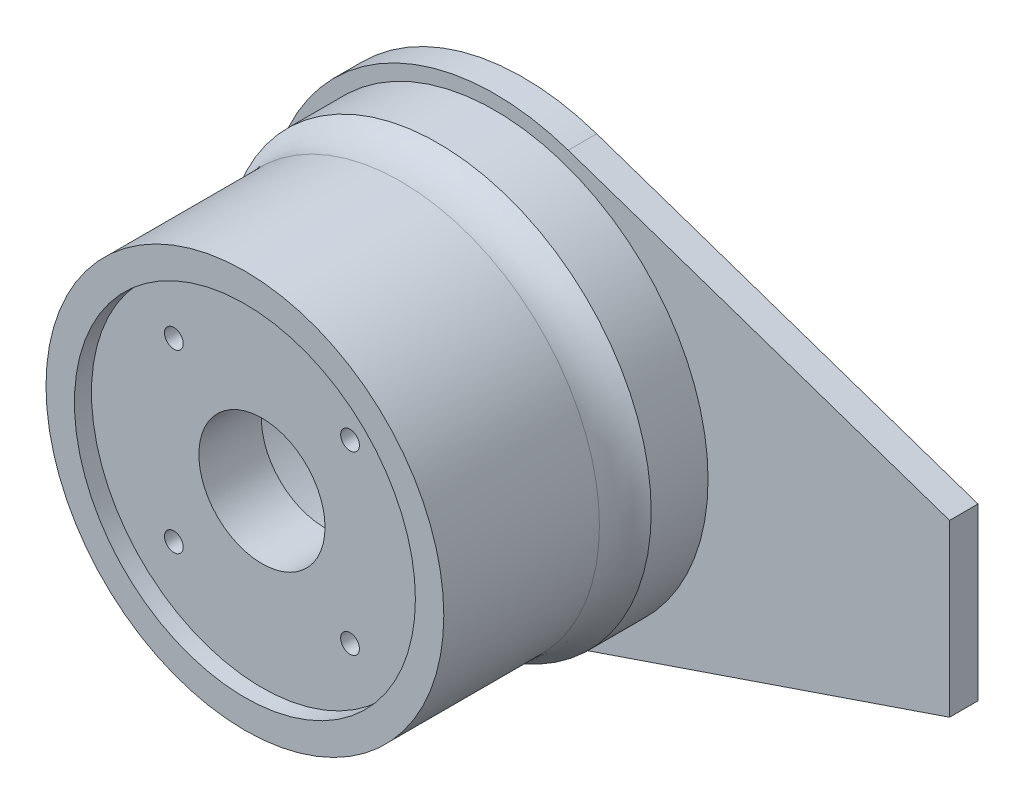
ISO-10303-21;
HEADER;
FILE_DESCRIPTION(('STEP AP214'),'2;1');
FILE_NAME('part.step','',(''),(''),'','','');
FILE_SCHEMA(('AUTOMOTIVE_DESIGN { 1 0 10303 214 1 1 1 1 }'));
ENDSEC;
DATA;
#1=APPLICATION_CONTEXT('core data for automotive mechanical design processes');
#2=APPLICATION_PROTOCOL_DEFINITION('international standard','automotive_design',2000,#1);
#3=PRODUCT_CONTEXT('',#1,'mechanical');
#4=PRODUCT('Part','Part','',(#3));
#5=PRODUCT_RELATED_PRODUCT_CATEGORY('part','',(#4));
#6=PRODUCT_DEFINITION_FORMATION('','',#4);
#7=PRODUCT_DEFINITION_CONTEXT('part definition',#1,'design');
#8=PRODUCT_DEFINITION('design','',#6,#7);
#9=PRODUCT_DEFINITION_SHAPE('','',#8);
#10=(LENGTH_UNIT() NAMED_UNIT(*) SI_UNIT(.MILLI.,.METRE.));
#11=(NAMED_UNIT(*) PLANE_ANGLE_UNIT() SI_UNIT($,.RADIAN.));
#12=(NAMED_UNIT(*) SI_UNIT($,.STERADIAN.) SOLID_ANGLE_UNIT());
#13=UNCERTAINTY_MEASURE_WITH_UNIT(LENGTH_MEASURE(1.E-05),#10,'distance_accuracy_value','');
#14=(GEOMETRIC_REPRESENTATION_CONTEXT(3) GLOBAL_UNCERTAINTY_ASSIGNED_CONTEXT((#13)) GLOBAL_UNIT_ASSIGNED_CONTEXT((#10,
#11,#12)) REPRESENTATION_CONTEXT('',''));
#15=CARTESIAN_POINT('',(0.,0.,0.));
#16=DIRECTION('',(0.,0.,1.));
#17=DIRECTION('',(1.,0.,0.));
#18=AXIS2_PLACEMENT_3D('',#15,#16,#17);
#19=CARTESIAN_POINT('',(0.,0.,14.));
#20=DIRECTION('',(0.,0.,-1.));
#21=DIRECTION('',(-1.,0.,0.));
#22=AXIS2_PLACEMENT_3D('',#19,#20,#21);
#23=CYLINDRICAL_SURFACE('',#22,11.1);
#24=CARTESIAN_POINT('',(0.,0.,0.));
#25=DIRECTION('',(0.,0.,1.));
#26=DIRECTION('',(1.,0.,0.));
#27=AXIS2_PLACEMENT_3D('',#24,#25,#26);
#28=CIRCLE('',#27,11.1);
#29=CARTESIAN_POINT('',(11.1,0.,0.));
#30=VERTEX_POINT('',#29);
#31=EDGE_CURVE('E127',#30,#30,#28,.T.);
#32=ORIENTED_EDGE('',*,*,#31,.F.);
#33=EDGE_LOOP('',(#32));
#34=FACE_BOUND('',#33,.T.);
#35=CARTESIAN_POINT('',(0.,0.,11.));
#36=DIRECTION('',(0.,0.,1.));
#37=DIRECTION('',(1.,0.,0.));
#38=AXIS2_PLACEMENT_3D('',#35,#36,#37);
#39=CIRCLE('',#38,11.1);
#40=CARTESIAN_POINT('',(11.1,0.,11.));
#41=VERTEX_POINT('',#40);
#42=EDGE_CURVE('E151',#41,#41,#39,.T.);
#43=ORIENTED_EDGE('',*,*,#42,.T.);
#44=EDGE_LOOP('',(#43));
#45=FACE_BOUND('',#44,.T.);
#46=ADVANCED_FACE('F35',(#34,#45),#23,.F.);
#47=CARTESIAN_POINT('',(-15.5,15.5,14.));
#48=DIRECTION('',(0.,0.,-1.));
#49=DIRECTION('',(-1.,0.,0.));
#50=AXIS2_PLACEMENT_3D('',#47,#48,#49);
#51=CYLINDRICAL_SURFACE('',#50,1.65);
#52=CARTESIAN_POINT('',(-15.5,15.5,0.));
#53=DIRECTION('',(0.,0.,1.));
#54=DIRECTION('',(1.,0.,0.));
#55=AXIS2_PLACEMENT_3D('',#52,#53,#54);
#56=CIRCLE('',#55,1.65);
#57=CARTESIAN_POINT('',(-13.85,15.5,0.));
#58=VERTEX_POINT('',#57);
#59=EDGE_CURVE('E136',#58,#58,#56,.T.);
#60=ORIENTED_EDGE('',*,*,#59,.F.);
#61=EDGE_LOOP('',(#60));
#62=FACE_BOUND('',#61,.T.);
#63=CARTESIAN_POINT('',(-15.5,15.5,11.));
#64=DIRECTION('',(0.,0.,1.));
#65=DIRECTION('',(1.,0.,0.));
#66=AXIS2_PLACEMENT_3D('',#63,#64,#65);
#67=CIRCLE('',#66,1.65);
#68=CARTESIAN_POINT('',(-13.85,15.5,11.));
#69=VERTEX_POINT('',#68);
#70=EDGE_CURVE('E153',#69,#69,#67,.T.);
#71=ORIENTED_EDGE('',*,*,#70,.T.);
#72=EDGE_LOOP('',(#71));
#73=FACE_BOUND('',#72,.T.);
#74=ADVANCED_FACE('F147',(#62,#73),#51,.F.);
#75=CARTESIAN_POINT('',(15.5,15.5000000000009,14.));
#76=DIRECTION('',(0.,0.,-1.));
#77=DIRECTION('',(-1.,0.,0.));
#78=AXIS2_PLACEMENT_3D('',#75,#76,#77);
#79=CYLINDRICAL_SURFACE('',#78,1.65000000000096);
#80=CARTESIAN_POINT('',(15.5,15.5000000000009,0.));
#81=DIRECTION('',(0.,0.,1.));
#82=DIRECTION('',(1.,0.,0.));
#83=AXIS2_PLACEMENT_3D('',#80,#81,#82);
#84=CIRCLE('',#83,1.65000000000096);
#85=CARTESIAN_POINT('',(17.150000000001,15.5000000000009,0.));
#86=VERTEX_POINT('',#85);
#87=EDGE_CURVE('E133',#86,#86,#84,.T.);
#88=ORIENTED_EDGE('',*,*,#87,.F.);
#89=EDGE_LOOP('',(#88));
#90=FACE_BOUND('',#89,.T.);
#91=CARTESIAN_POINT('',(15.5,15.5000000000009,11.));
#92=DIRECTION('',(0.,0.,1.));
#93=DIRECTION('',(1.,0.,0.));
#94=AXIS2_PLACEMENT_3D('',#91,#92,#93);
#95=CIRCLE('',#94,1.65000000000096);
#96=CARTESIAN_POINT('',(17.150000000001,15.5000000000009,11.));
#97=VERTEX_POINT('',#96);
#98=EDGE_CURVE('E158',#97,#97,#95,.T.);
#99=ORIENTED_EDGE('',*,*,#98,.T.);
#100=EDGE_LOOP('',(#99));
#101=FACE_BOUND('',#100,.T.);
#102=ADVANCED_FACE('F226',(#90,#101),#79,.F.);
#103=CARTESIAN_POINT('',(15.5000000000009,-15.4999999999991,14.));
#104=DIRECTION('',(0.,0.,-1.));
#105=DIRECTION('',(-1.,0.,0.));
#106=AXIS2_PLACEMENT_3D('',#103,#104,#105);
#107=CYLINDRICAL_SURFACE('',#106,1.65000000000129);
#108=CARTESIAN_POINT('',(15.5000000000009,-15.4999999999991,0.));
#109=DIRECTION('',(0.,0.,1.));
#110=DIRECTION('',(1.,0.,0.));
#111=AXIS2_PLACEMENT_3D('',#108,#109,#110);
#112=CIRCLE('',#111,1.65000000000129);
#113=CARTESIAN_POINT('',(17.1500000000022,-15.4999999999991,0.));
#114=VERTEX_POINT('',#113);
#115=EDGE_CURVE('E130',#114,#114,#112,.T.);
#116=ORIENTED_EDGE('',*,*,#115,.F.);
#117=EDGE_LOOP('',(#116));
#118=FACE_BOUND('',#117,.T.);
#119=CARTESIAN_POINT('',(15.5000000000009,-15.4999999999991,11.));
#120=DIRECTION('',(0.,0.,1.));
#121=DIRECTION('',(1.,0.,0.));
#122=AXIS2_PLACEMENT_3D('',#119,#120,#121);
#123=CIRCLE('',#122,1.65000000000129);
#124=CARTESIAN_POINT('',(17.1500000000022,-15.4999999999991,11.));
#125=VERTEX_POINT('',#124);
#126=EDGE_CURVE('E163',#125,#125,#123,.T.);
#127=ORIENTED_EDGE('',*,*,#126,.T.);
#128=EDGE_LOOP('',(#127));
#129=FACE_BOUND('',#128,.T.);
#130=ADVANCED_FACE('F230',(#118,#129),#107,.F.);
#131=CARTESIAN_POINT('',(-15.4999999999991,-15.5,14.));
#132=DIRECTION('',(0.,0.,-1.));
#133=DIRECTION('',(-1.,0.,0.));
#134=AXIS2_PLACEMENT_3D('',#131,#132,#133);
#135=CYLINDRICAL_SURFACE('',#134,1.65000000000051);
#136=CARTESIAN_POINT('',(-15.4999999999991,-15.5,0.));
#137=DIRECTION('',(0.,0.,1.));
#138=DIRECTION('',(1.,0.,0.));
#139=AXIS2_PLACEMENT_3D('',#136,#137,#138);
#140=CIRCLE('',#139,1.65000000000051);
#141=CARTESIAN_POINT('',(-13.8499999999986,-15.5,0.));
#142=VERTEX_POINT('',#141);
#143=EDGE_CURVE('E124',#142,#142,#140,.T.);
#144=ORIENTED_EDGE('',*,*,#143,.F.);
#145=EDGE_LOOP('',(#144));
#146=FACE_BOUND('',#145,.T.);
#147=CARTESIAN_POINT('',(-15.4999999999991,-15.5,11.));
#148=DIRECTION('',(0.,0.,1.));
#149=DIRECTION('',(1.,0.,0.));
#150=AXIS2_PLACEMENT_3D('',#147,#148,#149);
#151=CIRCLE('',#150,1.65000000000051);
#152=CARTESIAN_POINT('',(-13.8499999999986,-15.5,11.));
#153=VERTEX_POINT('',#152);
#154=EDGE_CURVE('E39',#153,#153,#151,.T.);
#155=ORIENTED_EDGE('',*,*,#154,.T.);
#156=EDGE_LOOP('',(#155));
#157=FACE_BOUND('',#156,.T.);
#158=ADVANCED_FACE('F176',(#146,#157),#135,.F.);
#159=CARTESIAN_POINT('',(0.,0.,0.));
#160=DIRECTION('',(0.,0.,1.));
#161=DIRECTION('',(1.,0.,0.));
#162=AXIS2_PLACEMENT_3D('',#159,#160,#161);
#163=PLANE('',#162);
#164=ORIENTED_EDGE('',*,*,#31,.T.);
#165=EDGE_LOOP('',(#164));
#166=FACE_BOUND('',#165,.T.);
#167=ORIENTED_EDGE('',*,*,#59,.T.);
#168=EDGE_LOOP('',(#167));
#169=FACE_BOUND('',#168,.T.);
#170=ORIENTED_EDGE('',*,*,#87,.T.);
#171=EDGE_LOOP('',(#170));
#172=FACE_BOUND('',#171,.T.);
#173=ORIENTED_EDGE('',*,*,#115,.T.);
#174=EDGE_LOOP('',(#173));
#175=FACE_BOUND('',#174,.T.);
#176=ORIENTED_EDGE('',*,*,#143,.T.);
#177=EDGE_LOOP('',(#176));
#178=FACE_BOUND('',#177,.T.);
#179=CARTESIAN_POINT('',(0.,0.,0.));
#180=DIRECTION('',(0.,0.,-1.));
#181=DIRECTION('',(-1.,0.,0.));
#182=AXIS2_PLACEMENT_3D('',#179,#180,#181);
#183=CIRCLE('',#182,29.905514518911);
#184=CARTESIAN_POINT('',(-29.905514518911,0.,0.));
#185=VERTEX_POINT('',#184);
#186=EDGE_CURVE('E119',#185,#185,#183,.T.);
#187=ORIENTED_EDGE('',*,*,#186,.T.);
#188=EDGE_LOOP('',(#187));
#189=FACE_BOUND('',#188,.T.);
#190=ADVANCED_FACE('F142',(#166,#169,#172,#175,#178,#189),#163,.F.);
#191=CARTESIAN_POINT('',(0.,0.,14.));
#192=DIRECTION('',(0.,0.,-1.));
#193=DIRECTION('',(-1.,0.,0.));
#194=AXIS2_PLACEMENT_3D('',#191,#192,#193);
#195=CYLINDRICAL_SURFACE('',#194,35.);
#196=CARTESIAN_POINT('',(0.,0.,-13.3856217223385));
#197=DIRECTION('',(0.,0.,-1.));
#198=DIRECTION('',(-1.,0.,0.));
#199=AXIS2_PLACEMENT_3D('',#196,#197,#198);
#200=CIRCLE('',#199,35.);
#201=CARTESIAN_POINT('',(-35.,0.,-13.3856217223385));
#202=VERTEX_POINT('',#201);
#203=EDGE_CURVE('E11',#202,#202,#200,.F.);
#204=ORIENTED_EDGE('',*,*,#203,.T.);
#205=EDGE_LOOP('',(#204));
#206=FACE_BOUND('',#205,.T.);
#207=CARTESIAN_POINT('',(0.,0.,14.));
#208=DIRECTION('',(0.,0.,1.));
#209=DIRECTION('',(1.,0.,0.));
#210=AXIS2_PLACEMENT_3D('',#207,#208,#209);
#211=CIRCLE('',#210,35.);
#212=CARTESIAN_POINT('',(35.,0.,14.));
#213=VERTEX_POINT('',#212);
#214=EDGE_CURVE('E45',#213,#213,#211,.T.);
#215=ORIENTED_EDGE('',*,*,#214,.F.);
#216=EDGE_LOOP('',(#215));
#217=FACE_BOUND('',#216,.T.);
#218=ADVANCED_FACE('F217',(#206,#217),#195,.T.);
#219=CARTESIAN_POINT('',(0.,0.,14.));
#220=DIRECTION('',(0.,0.,1.));
#221=DIRECTION('',(1.,0.,0.));
#222=AXIS2_PLACEMENT_3D('',#219,#220,#221);
#223=PLANE('',#222);
#224=CARTESIAN_POINT('',(0.,0.,14.));
#225=DIRECTION('',(0.,0.,1.));
#226=DIRECTION('',(1.,0.,0.));
#227=AXIS2_PLACEMENT_3D('',#224,#225,#226);
#228=CIRCLE('',#227,30.);
#229=CARTESIAN_POINT('',(30.,0.,14.));
#230=VERTEX_POINT('',#229);
#231=EDGE_CURVE('E166',#230,#230,#228,.T.);
#232=ORIENTED_EDGE('',*,*,#231,.F.);
#233=EDGE_LOOP('',(#232));
#234=FACE_BOUND('',#233,.T.);
#235=ORIENTED_EDGE('',*,*,#214,.T.);
#236=EDGE_LOOP('',(#235));
#237=FACE_BOUND('',#236,.T.);
#238=ADVANCED_FACE('F213',(#234,#237),#223,.T.);
#239=CARTESIAN_POINT('',(0.,0.,-20.));
#240=DIRECTION('',(0.,0.,1.));
#241=DIRECTION('',(1.,0.,0.));
#242=AXIS2_PLACEMENT_3D('',#239,#240,#241);
#243=CYLINDRICAL_SURFACE('',#242,29.905514518911);
#244=ORIENTED_EDGE('',*,*,#186,.F.);
#245=EDGE_LOOP('',(#244));
#246=FACE_BOUND('',#245,.T.);
#247=CARTESIAN_POINT('',(0.,0.,-35.));
#248=DIRECTION('',(0.,0.,-1.));
#249=DIRECTION('',(-1.,0.,0.));
#250=AXIS2_PLACEMENT_3D('',#247,#248,#249);
#251=CIRCLE('',#250,29.905514518911);
#252=CARTESIAN_POINT('',(-29.905514518911,0.,-35.));
#253=VERTEX_POINT('',#252);
#254=EDGE_CURVE('E108',#253,#253,#251,.T.);
#255=ORIENTED_EDGE('',*,*,#254,.T.);
#256=EDGE_LOOP('',(#255));
#257=FACE_BOUND('',#256,.T.);
#258=ADVANCED_FACE('F209',(#246,#257),#243,.F.);
#259=CARTESIAN_POINT('',(0.,0.,-30.));
#260=DIRECTION('',(0.,0.,1.));
#261=DIRECTION('',(1.,0.,0.));
#262=AXIS2_PLACEMENT_3D('',#259,#260,#261);
#263=CYLINDRICAL_SURFACE('',#262,37.5);
#264=CARTESIAN_POINT('',(0.,0.,-30.));
#265=DIRECTION('',(0.,0.,-1.));
#266=DIRECTION('',(-1.,0.,0.));
#267=AXIS2_PLACEMENT_3D('',#264,#265,#266);
#268=CIRCLE('',#267,37.5);
#269=CARTESIAN_POINT('',(-37.5,0.,-30.));
#270=VERTEX_POINT('',#269);
#271=EDGE_CURVE('E116',#270,#270,#268,.T.);
#272=ORIENTED_EDGE('',*,*,#271,.F.);
#273=EDGE_LOOP('',(#272));
#274=FACE_BOUND('',#273,.T.);
#275=CARTESIAN_POINT('',(0.,0.,-20.));
#276=DIRECTION('',(0.,0.,-1.));
#277=DIRECTION('',(-1.,0.,0.));
#278=AXIS2_PLACEMENT_3D('',#275,#276,#277);
#279=CIRCLE('',#278,37.5);
#280=CARTESIAN_POINT('',(-37.5,0.,-20.));
#281=VERTEX_POINT('',#280);
#282=EDGE_CURVE('E115',#281,#281,#279,.T.);
#283=ORIENTED_EDGE('',*,*,#282,.T.);
#284=EDGE_LOOP('',(#283));
#285=FACE_BOUND('',#284,.T.);
#286=ADVANCED_FACE('F206',(#274,#285),#263,.T.);
#287=CARTESIAN_POINT('',(0.,0.,-13.3856217223385));
#288=DIRECTION('',(0.,0.,-1.));
#289=DIRECTION('',(-1.,0.,0.));
#290=AXIS2_PLACEMENT_3D('',#287,#288,#289);
#291=TOROIDAL_SURFACE('',#290,45.,10.);
#292=ORIENTED_EDGE('',*,*,#203,.F.);
#293=EDGE_LOOP('',(#292));
#294=FACE_BOUND('',#293,.T.);
#295=ORIENTED_EDGE('',*,*,#282,.F.);
#296=EDGE_LOOP('',(#295));
#297=FACE_BOUND('',#296,.T.);
#298=ADVANCED_FACE('F37',(#294,#297),#291,.F.);
#299=CARTESIAN_POINT('',(0.,0.,-35.));
#300=DIRECTION('',(0.,0.,-1.));
#301=DIRECTION('',(-1.,0.,0.));
#302=AXIS2_PLACEMENT_3D('',#299,#300,#301);
#303=PLANE('',#302);
#304=CARTESIAN_POINT('',(0.,0.,-35.));
#305=DIRECTION('',(0.,0.,-1.));
#306=DIRECTION('',(-1.,0.,0.));
#307=AXIS2_PLACEMENT_3D('',#304,#305,#306);
#308=CIRCLE('',#307,40.);
#309=CARTESIAN_POINT('',(12.9007787718832,-37.8625132166227,-35.));
#310=VERTEX_POINT('',#309);
#311=CARTESIAN_POINT('',(12.9007787718832,37.8625132166227,-35.));
#312=VERTEX_POINT('',#311);
#313=EDGE_CURVE('E90',#310,#312,#308,.T.);
#314=ORIENTED_EDGE('',*,*,#313,.T.);
#315=DIRECTION('',(0.946562830415567,-0.322519469297081,0.));
#316=VECTOR('',#315,1.);
#317=CARTESIAN_POINT('',(12.9007787718832,37.8625132166227,-35.));
#318=LINE('',#317,#316);
#319=CARTESIAN_POINT('',(80.0000000000001,15.,-35.));
#320=VERTEX_POINT('',#319);
#321=EDGE_CURVE('E84',#312,#320,#318,.T.);
#322=ORIENTED_EDGE('',*,*,#321,.T.);
#323=DIRECTION('',(0.,-1.,0.));
#324=VECTOR('',#323,1.);
#325=CARTESIAN_POINT('',(80.0000000000001,15.,-35.));
#326=LINE('',#325,#324);
#327=CARTESIAN_POINT('',(80.0000000000001,-15.,-35.));
#328=VERTEX_POINT('',#327);
#329=EDGE_CURVE('E88',#320,#328,#326,.T.);
#330=ORIENTED_EDGE('',*,*,#329,.T.);
#331=DIRECTION('',(-0.946562830415567,-0.322519469297081,0.));
#332=VECTOR('',#331,1.);
#333=CARTESIAN_POINT('',(12.9007787718832,-37.8625132166227,-35.));
#334=LINE('',#333,#332);
#335=EDGE_CURVE('E53',#328,#310,#334,.T.);
#336=ORIENTED_EDGE('',*,*,#335,.T.);
#337=EDGE_LOOP('',(#314,#322,#330,#336));
#338=FACE_BOUND('',#337,.T.);
#339=ORIENTED_EDGE('',*,*,#254,.F.);
#340=EDGE_LOOP('',(#339));
#341=FACE_BOUND('',#340,.T.);
#342=ADVANCED_FACE('F85',(#338,#341),#303,.T.);
#343=CARTESIAN_POINT('',(0.,0.,-30.));
#344=DIRECTION('',(0.,0.,-1.));
#345=DIRECTION('',(-1.,0.,0.));
#346=AXIS2_PLACEMENT_3D('',#343,#344,#345);
#347=PLANE('',#346);
#348=ORIENTED_EDGE('',*,*,#271,.T.);
#349=EDGE_LOOP('',(#348));
#350=FACE_BOUND('',#349,.T.);
#351=CARTESIAN_POINT('',(0.,0.,-30.));
#352=DIRECTION('',(0.,0.,-1.));
#353=DIRECTION('',(-1.,0.,0.));
#354=AXIS2_PLACEMENT_3D('',#351,#352,#353);
#355=CIRCLE('',#354,40.);
#356=CARTESIAN_POINT('',(12.9007787718832,-37.8625132166227,-30.));
#357=VERTEX_POINT('',#356);
#358=CARTESIAN_POINT('',(12.9007787718832,37.8625132166227,-30.));
#359=VERTEX_POINT('',#358);
#360=EDGE_CURVE('E105',#357,#359,#355,.T.);
#361=ORIENTED_EDGE('',*,*,#360,.F.);
#362=DIRECTION('',(-0.946562830415567,-0.322519469297081,0.));
#363=VECTOR('',#362,1.);
#364=CARTESIAN_POINT('',(12.9007787718832,-37.8625132166227,-30.));
#365=LINE('',#364,#363);
#366=CARTESIAN_POINT('',(80.0000000000001,-15.,-30.));
#367=VERTEX_POINT('',#366);
#368=EDGE_CURVE('E76',#367,#357,#365,.T.);
#369=ORIENTED_EDGE('',*,*,#368,.F.);
#370=DIRECTION('',(0.,-1.,0.));
#371=VECTOR('',#370,1.);
#372=CARTESIAN_POINT('',(80.0000000000001,15.,-30.));
#373=LINE('',#372,#371);
#374=CARTESIAN_POINT('',(80.0000000000001,15.,-30.));
#375=VERTEX_POINT('',#374);
#376=EDGE_CURVE('E70',#375,#367,#373,.T.);
#377=ORIENTED_EDGE('',*,*,#376,.F.);
#378=DIRECTION('',(0.946562830415567,-0.322519469297081,0.));
#379=VECTOR('',#378,1.);
#380=CARTESIAN_POINT('',(12.9007787718832,37.8625132166227,-30.));
#381=LINE('',#380,#379);
#382=EDGE_CURVE('E95',#359,#375,#381,.T.);
#383=ORIENTED_EDGE('',*,*,#382,.F.);
#384=EDGE_LOOP('',(#361,#369,#377,#383));
#385=FACE_BOUND('',#384,.T.);
#386=ADVANCED_FACE('F192',(#350,#385),#347,.F.);
#387=CARTESIAN_POINT('',(0.,0.,-35.));
#388=DIRECTION('',(0.,0.,1.));
#389=DIRECTION('',(1.,0.,0.));
#390=AXIS2_PLACEMENT_3D('',#387,#388,#389);
#391=CYLINDRICAL_SURFACE('',#390,40.);
#392=ORIENTED_EDGE('',*,*,#360,.T.);
#393=DIRECTION('',(0.,0.,1.));
#394=VECTOR('',#393,1.);
#395=CARTESIAN_POINT('',(12.9007787718832,37.8625132166227,-35.));
#396=LINE('',#395,#394);
#397=EDGE_CURVE('E96',#312,#359,#396,.T.);
#398=ORIENTED_EDGE('',*,*,#397,.F.);
#399=ORIENTED_EDGE('',*,*,#313,.F.);
#400=DIRECTION('',(0.,0.,1.));
#401=VECTOR('',#400,1.);
#402=CARTESIAN_POINT('',(12.9007787718832,-37.8625132166227,-35.));
#403=LINE('',#402,#401);
#404=EDGE_CURVE('E101',#310,#357,#403,.T.);
#405=ORIENTED_EDGE('',*,*,#404,.T.);
#406=EDGE_LOOP('',(#392,#398,#399,#405));
#407=FACE_BOUND('',#406,.T.);
#408=ADVANCED_FACE('F195',(#407),#391,.T.);
#409=CARTESIAN_POINT('',(12.9007787718832,37.8625132166227,-35.));
#410=DIRECTION('',(-0.322519469297081,-0.946562830415567,0.));
#411=DIRECTION('',(0.946562830415567,-0.322519469297081,0.));
#412=AXIS2_PLACEMENT_3D('',#409,#410,#411);
#413=PLANE('',#412);
#414=ORIENTED_EDGE('',*,*,#382,.T.);
#415=DIRECTION('',(0.,0.,1.));
#416=VECTOR('',#415,1.);
#417=CARTESIAN_POINT('',(80.0000000000001,15.,-35.));
#418=LINE('',#417,#416);
#419=EDGE_CURVE('E93',#320,#375,#418,.T.);
#420=ORIENTED_EDGE('',*,*,#419,.F.);
#421=ORIENTED_EDGE('',*,*,#321,.F.);
#422=ORIENTED_EDGE('',*,*,#397,.T.);
#423=EDGE_LOOP('',(#414,#420,#421,#422));
#424=FACE_BOUND('',#423,.T.);
#425=ADVANCED_FACE('F94',(#424),#413,.F.);
#426=CARTESIAN_POINT('',(80.0000000000001,15.,-35.));
#427=DIRECTION('',(-1.,0.,0.));
#428=DIRECTION('',(0.,0.,1.));
#429=AXIS2_PLACEMENT_3D('',#426,#427,#428);
#430=PLANE('',#429);
#431=ORIENTED_EDGE('',*,*,#376,.T.);
#432=DIRECTION('',(0.,0.,1.));
#433=VECTOR('',#432,1.);
#434=CARTESIAN_POINT('',(80.0000000000001,-15.,-35.));
#435=LINE('',#434,#433);
#436=EDGE_CURVE('E97',#328,#367,#435,.T.);
#437=ORIENTED_EDGE('',*,*,#436,.F.);
#438=ORIENTED_EDGE('',*,*,#329,.F.);
#439=ORIENTED_EDGE('',*,*,#419,.T.);
#440=EDGE_LOOP('',(#431,#437,#438,#439));
#441=FACE_BOUND('',#440,.T.);
#442=ADVANCED_FACE('F99',(#441),#430,.F.);
#443=CARTESIAN_POINT('',(12.9007787718832,-37.8625132166227,-35.));
#444=DIRECTION('',(-0.322519469297081,0.946562830415567,0.));
#445=DIRECTION('',(-0.946562830415567,-0.322519469297081,0.));
#446=AXIS2_PLACEMENT_3D('',#443,#444,#445);
#447=PLANE('',#446);
#448=ORIENTED_EDGE('',*,*,#368,.T.);
#449=ORIENTED_EDGE('',*,*,#404,.F.);
#450=ORIENTED_EDGE('',*,*,#335,.F.);
#451=ORIENTED_EDGE('',*,*,#436,.T.);
#452=EDGE_LOOP('',(#448,#449,#450,#451));
#453=FACE_BOUND('',#452,.T.);
#454=ADVANCED_FACE('F185',(#453),#447,.F.);
#455=CARTESIAN_POINT('',(0.,0.,11.));
#456=DIRECTION('',(0.,0.,1.));
#457=DIRECTION('',(1.,0.,0.));
#458=AXIS2_PLACEMENT_3D('',#455,#456,#457);
#459=CYLINDRICAL_SURFACE('',#458,30.);
#460=CARTESIAN_POINT('',(0.,0.,11.));
#461=DIRECTION('',(0.,0.,1.));
#462=DIRECTION('',(1.,0.,0.));
#463=AXIS2_PLACEMENT_3D('',#460,#461,#462);
#464=CIRCLE('',#463,30.);
#465=CARTESIAN_POINT('',(30.,0.,11.));
#466=VERTEX_POINT('',#465);
#467=EDGE_CURVE('E169',#466,#466,#464,.T.);
#468=ORIENTED_EDGE('',*,*,#467,.F.);
#469=EDGE_LOOP('',(#468));
#470=FACE_BOUND('',#469,.T.);
#471=ORIENTED_EDGE('',*,*,#231,.T.);
#472=EDGE_LOOP('',(#471));
#473=FACE_BOUND('',#472,.T.);
#474=ADVANCED_FACE('F180',(#470,#473),#459,.F.);
#475=CARTESIAN_POINT('',(0.,0.,11.));
#476=DIRECTION('',(0.,0.,1.));
#477=DIRECTION('',(1.,0.,0.));
#478=AXIS2_PLACEMENT_3D('',#475,#476,#477);
#479=PLANE('',#478);
#480=ORIENTED_EDGE('',*,*,#42,.F.);
#481=EDGE_LOOP('',(#480));
#482=FACE_BOUND('',#481,.T.);
#483=ORIENTED_EDGE('',*,*,#70,.F.);
#484=EDGE_LOOP('',(#483));
#485=FACE_BOUND('',#484,.T.);
#486=ORIENTED_EDGE('',*,*,#98,.F.);
#487=EDGE_LOOP('',(#486));
#488=FACE_BOUND('',#487,.T.);
#489=ORIENTED_EDGE('',*,*,#126,.F.);
#490=EDGE_LOOP('',(#489));
#491=FACE_BOUND('',#490,.T.);
#492=ORIENTED_EDGE('',*,*,#154,.F.);
#493=EDGE_LOOP('',(#492));
#494=FACE_BOUND('',#493,.T.);
#495=ORIENTED_EDGE('',*,*,#467,.T.);
#496=EDGE_LOOP('',(#495));
#497=FACE_BOUND('',#496,.T.);
#498=ADVANCED_FACE('F178',(#482,#485,#488,#491,#494,#497),#479,.T.);
#499=CLOSED_SHELL('',(#46,#74,#102,#130,#158,#190,#218,#238,#258,#286,#298,#342,#386,#408,#425,
#442,#454,#474,#498));
#500=MANIFOLD_SOLID_BREP('B2',#499);
#501=ADVANCED_BREP_SHAPE_REPRESENTATION('',(#18,#500),#14);
#502=SHAPE_DEFINITION_REPRESENTATION(#9,#501);
ENDSEC;
END-ISO-10303-21;
